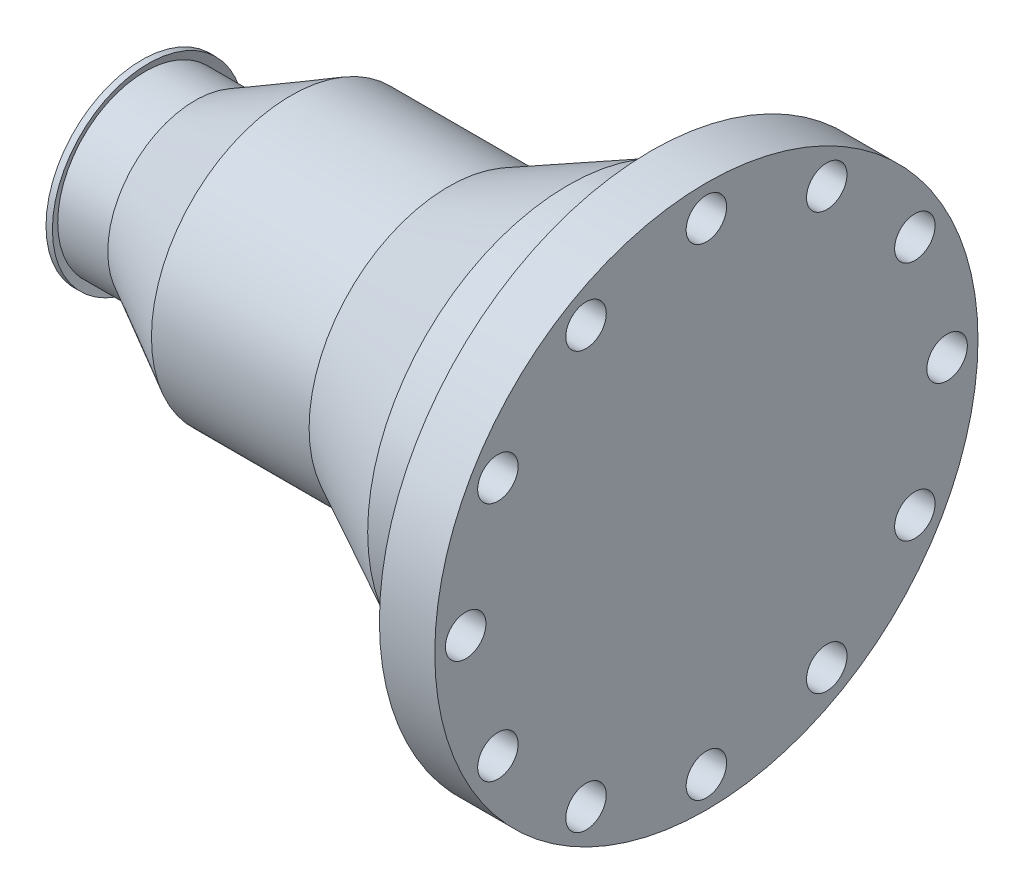
ISO-10303-21;
HEADER;
FILE_DESCRIPTION(('STEP AP214'),'2;1');
FILE_NAME('part.step','',(''),(''),'','','');
FILE_SCHEMA(('AUTOMOTIVE_DESIGN { 1 0 10303 214 1 1 1 1 }'));
ENDSEC;
DATA;
#1=APPLICATION_CONTEXT('core data for automotive mechanical design processes');
#2=APPLICATION_PROTOCOL_DEFINITION('international standard','automotive_design',2000,#1);
#3=PRODUCT_CONTEXT('',#1,'mechanical');
#4=PRODUCT('Part','Part','',(#3));
#5=PRODUCT_RELATED_PRODUCT_CATEGORY('part','',(#4));
#6=PRODUCT_DEFINITION_FORMATION('','',#4);
#7=PRODUCT_DEFINITION_CONTEXT('part definition',#1,'design');
#8=PRODUCT_DEFINITION('design','',#6,#7);
#9=PRODUCT_DEFINITION_SHAPE('','',#8);
#10=(LENGTH_UNIT() NAMED_UNIT(*) SI_UNIT(.MILLI.,.METRE.));
#11=(NAMED_UNIT(*) PLANE_ANGLE_UNIT() SI_UNIT($,.RADIAN.));
#12=(NAMED_UNIT(*) SI_UNIT($,.STERADIAN.) SOLID_ANGLE_UNIT());
#13=UNCERTAINTY_MEASURE_WITH_UNIT(LENGTH_MEASURE(1.E-05),#10,'distance_accuracy_value','');
#14=(GEOMETRIC_REPRESENTATION_CONTEXT(3) GLOBAL_UNCERTAINTY_ASSIGNED_CONTEXT((#13)) GLOBAL_UNIT_ASSIGNED_CONTEXT((#10,
#11,#12)) REPRESENTATION_CONTEXT('',''));
#15=CARTESIAN_POINT('',(0.,0.,0.));
#16=DIRECTION('',(0.,0.,1.));
#17=DIRECTION('',(1.,0.,0.));
#18=AXIS2_PLACEMENT_3D('',#15,#16,#17);
#19=CARTESIAN_POINT('',(0.,0.,0.));
#20=DIRECTION('',(1.,0.,0.));
#21=DIRECTION('',(0.,0.,-1.));
#22=AXIS2_PLACEMENT_3D('',#19,#20,#21);
#23=PLANE('',#22);
#24=CARTESIAN_POINT('',(0.,0.,0.));
#25=DIRECTION('',(-1.,0.,0.));
#26=DIRECTION('',(0.,0.,1.));
#27=AXIS2_PLACEMENT_3D('',#24,#25,#26);
#28=CIRCLE('',#27,31.);
#29=CARTESIAN_POINT('',(0.,0.,31.));
#30=VERTEX_POINT('',#29);
#31=EDGE_CURVE('E80',#30,#30,#28,.T.);
#32=ORIENTED_EDGE('',*,*,#31,.F.);
#33=EDGE_LOOP('',(#32));
#34=FACE_BOUND('',#33,.T.);
#35=CARTESIAN_POINT('',(0.,0.,0.));
#36=DIRECTION('',(-1.,0.,0.));
#37=DIRECTION('',(0.,0.,1.));
#38=AXIS2_PLACEMENT_3D('',#35,#36,#37);
#39=CIRCLE('',#38,45.);
#40=CARTESIAN_POINT('',(0.,0.,45.));
#41=VERTEX_POINT('',#40);
#42=EDGE_CURVE('E10',#41,#41,#39,.T.);
#43=ORIENTED_EDGE('',*,*,#42,.T.);
#44=EDGE_LOOP('',(#43));
#45=FACE_BOUND('',#44,.T.);
#46=ADVANCED_FACE('F37',(#34,#45),#23,.F.);
#47=CARTESIAN_POINT('',(0.,0.,0.));
#48=DIRECTION('',(-1.,0.,0.));
#49=DIRECTION('',(0.,0.,1.));
#50=AXIS2_PLACEMENT_3D('',#47,#48,#49);
#51=CYLINDRICAL_SURFACE('',#50,45.);
#52=ORIENTED_EDGE('',*,*,#42,.F.);
#53=EDGE_LOOP('',(#52));
#54=FACE_BOUND('',#53,.T.);
#55=CARTESIAN_POINT('',(3.,0.,0.));
#56=DIRECTION('',(-1.,0.,0.));
#57=DIRECTION('',(0.,0.,1.));
#58=AXIS2_PLACEMENT_3D('',#55,#56,#57);
#59=CIRCLE('',#58,45.);
#60=CARTESIAN_POINT('',(3.,0.,45.));
#61=VERTEX_POINT('',#60);
#62=EDGE_CURVE('E43',#61,#61,#59,.T.);
#63=ORIENTED_EDGE('',*,*,#62,.T.);
#64=EDGE_LOOP('',(#63));
#65=FACE_BOUND('',#64,.T.);
#66=ADVANCED_FACE('F238',(#54,#65),#51,.T.);
#67=CARTESIAN_POINT('',(1.5,0.,0.));
#68=DIRECTION('',(1.,0.,0.));
#69=DIRECTION('',(0.,0.,-1.));
#70=AXIS2_PLACEMENT_3D('',#67,#68,#69);
#71=CONICAL_SURFACE('',#70,41.,1.21202565652432);
#72=ORIENTED_EDGE('',*,*,#62,.F.);
#73=EDGE_LOOP('',(#72));
#74=FACE_BOUND('',#73,.T.);
#75=CARTESIAN_POINT('',(1.5,0.,0.));
#76=DIRECTION('',(-1.,0.,0.));
#77=DIRECTION('',(0.,0.,1.));
#78=AXIS2_PLACEMENT_3D('',#75,#76,#77);
#79=CIRCLE('',#78,41.);
#80=CARTESIAN_POINT('',(1.5,0.,41.));
#81=VERTEX_POINT('',#80);
#82=EDGE_CURVE('E47',#81,#81,#79,.T.);
#83=ORIENTED_EDGE('',*,*,#82,.T.);
#84=EDGE_LOOP('',(#83));
#85=FACE_BOUND('',#84,.T.);
#86=ADVANCED_FACE('F244',(#74,#85),#71,.F.);
#87=CARTESIAN_POINT('',(0.,0.,0.));
#88=DIRECTION('',(-1.,0.,0.));
#89=DIRECTION('',(0.,0.,1.));
#90=AXIS2_PLACEMENT_3D('',#87,#88,#89);
#91=CYLINDRICAL_SURFACE('',#90,41.);
#92=ORIENTED_EDGE('',*,*,#82,.F.);
#93=EDGE_LOOP('',(#92));
#94=FACE_BOUND('',#93,.T.);
#95=CARTESIAN_POINT('',(25.,0.,0.));
#96=DIRECTION('',(-1.,0.,0.));
#97=DIRECTION('',(0.,0.,1.));
#98=AXIS2_PLACEMENT_3D('',#95,#96,#97);
#99=CIRCLE('',#98,41.);
#100=CARTESIAN_POINT('',(25.,0.,41.));
#101=VERTEX_POINT('',#100);
#102=EDGE_CURVE('E51',#101,#101,#99,.T.);
#103=ORIENTED_EDGE('',*,*,#102,.T.);
#104=EDGE_LOOP('',(#103));
#105=FACE_BOUND('',#104,.T.);
#106=ADVANCED_FACE('F574',(#94,#105),#91,.T.);
#107=CARTESIAN_POINT('',(70.,0.,0.));
#108=DIRECTION('',(1.,0.,0.));
#109=DIRECTION('',(0.,0.,-1.));
#110=AXIS2_PLACEMENT_3D('',#107,#108,#109);
#111=CONICAL_SURFACE('',#110,65.5,0.498567905638218);
#112=ORIENTED_EDGE('',*,*,#102,.F.);
#113=EDGE_LOOP('',(#112));
#114=FACE_BOUND('',#113,.T.);
#115=CARTESIAN_POINT('',(70.,0.,0.));
#116=DIRECTION('',(-1.,0.,0.));
#117=DIRECTION('',(0.,0.,1.));
#118=AXIS2_PLACEMENT_3D('',#115,#116,#117);
#119=CIRCLE('',#118,65.5);
#120=CARTESIAN_POINT('',(70.,0.,65.5));
#121=VERTEX_POINT('',#120);
#122=EDGE_CURVE('E56',#121,#121,#119,.T.);
#123=ORIENTED_EDGE('',*,*,#122,.T.);
#124=EDGE_LOOP('',(#123));
#125=FACE_BOUND('',#124,.T.);
#126=ADVANCED_FACE('F565',(#114,#125),#111,.T.);
#127=CARTESIAN_POINT('',(0.,0.,0.));
#128=DIRECTION('',(-1.,0.,0.));
#129=DIRECTION('',(0.,0.,1.));
#130=AXIS2_PLACEMENT_3D('',#127,#128,#129);
#131=CYLINDRICAL_SURFACE('',#130,65.5);
#132=ORIENTED_EDGE('',*,*,#122,.F.);
#133=EDGE_LOOP('',(#132));
#134=FACE_BOUND('',#133,.T.);
#135=CARTESIAN_POINT('',(144.,0.,0.));
#136=DIRECTION('',(-1.,0.,0.));
#137=DIRECTION('',(0.,0.,1.));
#138=AXIS2_PLACEMENT_3D('',#135,#136,#137);
#139=CIRCLE('',#138,65.5);
#140=CARTESIAN_POINT('',(144.,0.,65.5));
#141=VERTEX_POINT('',#140);
#142=EDGE_CURVE('E59',#141,#141,#139,.T.);
#143=ORIENTED_EDGE('',*,*,#142,.T.);
#144=EDGE_LOOP('',(#143));
#145=FACE_BOUND('',#144,.T.);
#146=ADVANCED_FACE('F556',(#134,#145),#131,.T.);
#147=CARTESIAN_POINT('',(200.,0.,0.));
#148=DIRECTION('',(1.,0.,0.));
#149=DIRECTION('',(0.,0.,-1.));
#150=AXIS2_PLACEMENT_3D('',#147,#148,#149);
#151=CONICAL_SURFACE('',#150,94.,0.470764926542016);
#152=ORIENTED_EDGE('',*,*,#142,.F.);
#153=EDGE_LOOP('',(#152));
#154=FACE_BOUND('',#153,.T.);
#155=CARTESIAN_POINT('',(200.,0.,0.));
#156=DIRECTION('',(-1.,0.,0.));
#157=DIRECTION('',(0.,0.,1.));
#158=AXIS2_PLACEMENT_3D('',#155,#156,#157);
#159=CIRCLE('',#158,94.);
#160=CARTESIAN_POINT('',(200.,0.,94.));
#161=VERTEX_POINT('',#160);
#162=EDGE_CURVE('E62',#161,#161,#159,.T.);
#163=ORIENTED_EDGE('',*,*,#162,.T.);
#164=EDGE_LOOP('',(#163));
#165=FACE_BOUND('',#164,.T.);
#166=ADVANCED_FACE('F547',(#154,#165),#151,.T.);
#167=CARTESIAN_POINT('',(0.,0.,0.));
#168=DIRECTION('',(-1.,0.,0.));
#169=DIRECTION('',(0.,0.,1.));
#170=AXIS2_PLACEMENT_3D('',#167,#168,#169);
#171=CYLINDRICAL_SURFACE('',#170,94.);
#172=ORIENTED_EDGE('',*,*,#162,.F.);
#173=EDGE_LOOP('',(#172));
#174=FACE_BOUND('',#173,.T.);
#175=CARTESIAN_POINT('',(220.,0.,0.));
#176=DIRECTION('',(-1.,0.,0.));
#177=DIRECTION('',(0.,0.,1.));
#178=AXIS2_PLACEMENT_3D('',#175,#176,#177);
#179=CIRCLE('',#178,94.);
#180=CARTESIAN_POINT('',(220.,0.,94.));
#181=VERTEX_POINT('',#180);
#182=EDGE_CURVE('E65',#181,#181,#179,.T.);
#183=ORIENTED_EDGE('',*,*,#182,.T.);
#184=EDGE_LOOP('',(#183));
#185=FACE_BOUND('',#184,.T.);
#186=ADVANCED_FACE('F538',(#174,#185),#171,.T.);
#187=CARTESIAN_POINT('',(220.,94.,0.));
#188=DIRECTION('',(1.,0.,0.));
#189=DIRECTION('',(0.,0.,-1.));
#190=AXIS2_PLACEMENT_3D('',#187,#188,#189);
#191=PLANE('',#190);
#192=ORIENTED_EDGE('',*,*,#182,.F.);
#193=EDGE_LOOP('',(#192));
#194=FACE_BOUND('',#193,.T.);
#195=CARTESIAN_POINT('',(220.,0.,0.));
#196=DIRECTION('',(-1.,0.,0.));
#197=DIRECTION('',(0.,0.,1.));
#198=AXIS2_PLACEMENT_3D('',#195,#196,#197);
#199=CIRCLE('',#198,95.);
#200=CARTESIAN_POINT('',(220.,0.,95.));
#201=VERTEX_POINT('',#200);
#202=EDGE_CURVE('E68',#201,#201,#199,.T.);
#203=ORIENTED_EDGE('',*,*,#202,.T.);
#204=EDGE_LOOP('',(#203));
#205=FACE_BOUND('',#204,.T.);
#206=ADVANCED_FACE('F529',(#194,#205),#191,.F.);
#207=CARTESIAN_POINT('',(0.,0.,0.));
#208=DIRECTION('',(-1.,0.,0.));
#209=DIRECTION('',(0.,0.,1.));
#210=AXIS2_PLACEMENT_3D('',#207,#208,#209);
#211=CYLINDRICAL_SURFACE('',#210,95.);
#212=ORIENTED_EDGE('',*,*,#202,.F.);
#213=EDGE_LOOP('',(#212));
#214=FACE_BOUND('',#213,.T.);
#215=CARTESIAN_POINT('',(239.,0.,0.));
#216=DIRECTION('',(-1.,0.,0.));
#217=DIRECTION('',(0.,0.,1.));
#218=AXIS2_PLACEMENT_3D('',#215,#216,#217);
#219=CIRCLE('',#218,95.);
#220=CARTESIAN_POINT('',(239.,0.,95.));
#221=VERTEX_POINT('',#220);
#222=EDGE_CURVE('E71',#221,#221,#219,.T.);
#223=ORIENTED_EDGE('',*,*,#222,.T.);
#224=EDGE_LOOP('',(#223));
#225=FACE_BOUND('',#224,.T.);
#226=ADVANCED_FACE('F234',(#214,#225),#211,.T.);
#227=CARTESIAN_POINT('',(239.,100.,0.));
#228=DIRECTION('',(1.,0.,0.));
#229=DIRECTION('',(0.,0.,-1.));
#230=AXIS2_PLACEMENT_3D('',#227,#228,#229);
#231=PLANE('',#230);
#232=CARTESIAN_POINT('',(239.,97.8608706276416,-56.5));
#233=DIRECTION('',(1.,0.,0.));
#234=DIRECTION('',(0.,0.,-1.));
#235=AXIS2_PLACEMENT_3D('',#232,#233,#234);
#236=CIRCLE('',#235,9.50000000000001);
#237=CARTESIAN_POINT('',(239.,97.8608706276416,-66.));
#238=VERTEX_POINT('',#237);
#239=EDGE_CURVE('E185',#238,#238,#236,.F.);
#240=ORIENTED_EDGE('',*,*,#239,.F.);
#241=EDGE_LOOP('',(#240));
#242=FACE_BOUND('',#241,.T.);
#243=CARTESIAN_POINT('',(239.,56.4999999999999,-97.8608706276416));
#244=DIRECTION('',(1.,0.,0.));
#245=DIRECTION('',(0.,0.,-1.));
#246=AXIS2_PLACEMENT_3D('',#243,#244,#245);
#247=CIRCLE('',#246,9.5);
#248=CARTESIAN_POINT('',(239.,56.4999999999999,-107.360870627642));
#249=VERTEX_POINT('',#248);
#250=EDGE_CURVE('E179',#249,#249,#247,.F.);
#251=ORIENTED_EDGE('',*,*,#250,.F.);
#252=EDGE_LOOP('',(#251));
#253=FACE_BOUND('',#252,.T.);
#254=CARTESIAN_POINT('',(239.,0.,-113.));
#255=DIRECTION('',(1.,0.,0.));
#256=DIRECTION('',(0.,0.,-1.));
#257=AXIS2_PLACEMENT_3D('',#254,#255,#256);
#258=CIRCLE('',#257,9.49999999999999);
#259=CARTESIAN_POINT('',(239.,0.,-122.5));
#260=VERTEX_POINT('',#259);
#261=EDGE_CURVE('E173',#260,#260,#258,.F.);
#262=ORIENTED_EDGE('',*,*,#261,.F.);
#263=EDGE_LOOP('',(#262));
#264=FACE_BOUND('',#263,.T.);
#265=CARTESIAN_POINT('',(239.,-56.5,-97.8608706276415));
#266=DIRECTION('',(1.,0.,0.));
#267=DIRECTION('',(0.,0.,-1.));
#268=AXIS2_PLACEMENT_3D('',#265,#266,#267);
#269=CIRCLE('',#268,9.5);
#270=CARTESIAN_POINT('',(239.,-56.5,-107.360870627642));
#271=VERTEX_POINT('',#270);
#272=EDGE_CURVE('E167',#271,#271,#269,.F.);
#273=ORIENTED_EDGE('',*,*,#272,.F.);
#274=EDGE_LOOP('',(#273));
#275=FACE_BOUND('',#274,.T.);
#276=CARTESIAN_POINT('',(239.,-97.8608706276416,-56.5));
#277=DIRECTION('',(1.,0.,0.));
#278=DIRECTION('',(0.,0.,-1.));
#279=AXIS2_PLACEMENT_3D('',#276,#277,#278);
#280=CIRCLE('',#279,9.50000000000001);
#281=CARTESIAN_POINT('',(239.,-97.8608706276416,-66.));
#282=VERTEX_POINT('',#281);
#283=EDGE_CURVE('E161',#282,#282,#280,.F.);
#284=ORIENTED_EDGE('',*,*,#283,.F.);
#285=EDGE_LOOP('',(#284));
#286=FACE_BOUND('',#285,.T.);
#287=CARTESIAN_POINT('',(239.,-113.,0.));
#288=DIRECTION('',(1.,0.,0.));
#289=DIRECTION('',(0.,0.,-1.));
#290=AXIS2_PLACEMENT_3D('',#287,#288,#289);
#291=CIRCLE('',#290,9.49999999999998);
#292=CARTESIAN_POINT('',(239.,-113.,-9.49999999999998));
#293=VERTEX_POINT('',#292);
#294=EDGE_CURVE('E155',#293,#293,#291,.F.);
#295=ORIENTED_EDGE('',*,*,#294,.F.);
#296=EDGE_LOOP('',(#295));
#297=FACE_BOUND('',#296,.T.);
#298=CARTESIAN_POINT('',(239.,-97.8608706276415,56.5));
#299=DIRECTION('',(1.,0.,0.));
#300=DIRECTION('',(0.,0.,-1.));
#301=AXIS2_PLACEMENT_3D('',#298,#299,#300);
#302=CIRCLE('',#301,9.5);
#303=CARTESIAN_POINT('',(239.,-97.8608706276415,47.));
#304=VERTEX_POINT('',#303);
#305=EDGE_CURVE('E149',#304,#304,#302,.F.);
#306=ORIENTED_EDGE('',*,*,#305,.F.);
#307=EDGE_LOOP('',(#306));
#308=FACE_BOUND('',#307,.T.);
#309=CARTESIAN_POINT('',(239.,-56.5,97.8608706276416));
#310=DIRECTION('',(1.,0.,0.));
#311=DIRECTION('',(0.,0.,-1.));
#312=AXIS2_PLACEMENT_3D('',#309,#310,#311);
#313=CIRCLE('',#312,9.5);
#314=CARTESIAN_POINT('',(239.,-56.5,88.3608706276416));
#315=VERTEX_POINT('',#314);
#316=EDGE_CURVE('E143',#315,#315,#313,.F.);
#317=ORIENTED_EDGE('',*,*,#316,.F.);
#318=EDGE_LOOP('',(#317));
#319=FACE_BOUND('',#318,.T.);
#320=CARTESIAN_POINT('',(239.,0.,113.));
#321=DIRECTION('',(1.,0.,0.));
#322=DIRECTION('',(0.,0.,-1.));
#323=AXIS2_PLACEMENT_3D('',#320,#321,#322);
#324=CIRCLE('',#323,9.49999999999999);
#325=CARTESIAN_POINT('',(239.,0.,103.5));
#326=VERTEX_POINT('',#325);
#327=EDGE_CURVE('E137',#326,#326,#324,.F.);
#328=ORIENTED_EDGE('',*,*,#327,.F.);
#329=EDGE_LOOP('',(#328));
#330=FACE_BOUND('',#329,.T.);
#331=CARTESIAN_POINT('',(239.,56.5,97.8608706276416));
#332=DIRECTION('',(1.,0.,0.));
#333=DIRECTION('',(0.,0.,-1.));
#334=AXIS2_PLACEMENT_3D('',#331,#332,#333);
#335=CIRCLE('',#334,9.5);
#336=CARTESIAN_POINT('',(239.,56.5,88.3608706276416));
#337=VERTEX_POINT('',#336);
#338=EDGE_CURVE('E131',#337,#337,#335,.F.);
#339=ORIENTED_EDGE('',*,*,#338,.F.);
#340=EDGE_LOOP('',(#339));
#341=FACE_BOUND('',#340,.T.);
#342=CARTESIAN_POINT('',(239.,97.8608706276416,56.5));
#343=DIRECTION('',(1.,0.,0.));
#344=DIRECTION('',(0.,0.,-1.));
#345=AXIS2_PLACEMENT_3D('',#342,#343,#344);
#346=CIRCLE('',#345,9.5);
#347=CARTESIAN_POINT('',(239.,97.8608706276416,47.));
#348=VERTEX_POINT('',#347);
#349=EDGE_CURVE('E125',#348,#348,#346,.F.);
#350=ORIENTED_EDGE('',*,*,#349,.F.);
#351=EDGE_LOOP('',(#350));
#352=FACE_BOUND('',#351,.T.);
#353=CARTESIAN_POINT('',(239.,113.,0.));
#354=DIRECTION('',(1.,0.,0.));
#355=DIRECTION('',(0.,0.,-1.));
#356=AXIS2_PLACEMENT_3D('',#353,#354,#355);
#357=CIRCLE('',#356,9.50000000000001);
#358=CARTESIAN_POINT('',(239.,113.,-9.50000000000001));
#359=VERTEX_POINT('',#358);
#360=EDGE_CURVE('E119',#359,#359,#357,.F.);
#361=ORIENTED_EDGE('',*,*,#360,.F.);
#362=EDGE_LOOP('',(#361));
#363=FACE_BOUND('',#362,.T.);
#364=ORIENTED_EDGE('',*,*,#222,.F.);
#365=EDGE_LOOP('',(#364));
#366=FACE_BOUND('',#365,.T.);
#367=CARTESIAN_POINT('',(239.,0.,0.));
#368=DIRECTION('',(-1.,0.,0.));
#369=DIRECTION('',(0.,0.,1.));
#370=AXIS2_PLACEMENT_3D('',#367,#368,#369);
#371=CIRCLE('',#370,127.5);
#372=CARTESIAN_POINT('',(239.,0.,127.5));
#373=VERTEX_POINT('',#372);
#374=EDGE_CURVE('E74',#373,#373,#371,.T.);
#375=ORIENTED_EDGE('',*,*,#374,.T.);
#376=EDGE_LOOP('',(#375));
#377=FACE_BOUND('',#376,.T.);
#378=ADVANCED_FACE('F226',(#242,#253,#264,#275,#286,#297,#308,#319,#330,#341,#352,#363,#366,
#377),#231,.F.);
#379=CARTESIAN_POINT('',(0.,0.,0.));
#380=DIRECTION('',(-1.,0.,0.));
#381=DIRECTION('',(0.,0.,1.));
#382=AXIS2_PLACEMENT_3D('',#379,#380,#381);
#383=CYLINDRICAL_SURFACE('',#382,127.5);
#384=ORIENTED_EDGE('',*,*,#374,.F.);
#385=EDGE_LOOP('',(#384));
#386=FACE_BOUND('',#385,.T.);
#387=CARTESIAN_POINT('',(265.,0.,0.));
#388=DIRECTION('',(-1.,0.,0.));
#389=DIRECTION('',(0.,0.,1.));
#390=AXIS2_PLACEMENT_3D('',#387,#388,#389);
#391=CIRCLE('',#390,127.5);
#392=CARTESIAN_POINT('',(265.,0.,127.5));
#393=VERTEX_POINT('',#392);
#394=EDGE_CURVE('E77',#393,#393,#391,.T.);
#395=ORIENTED_EDGE('',*,*,#394,.T.);
#396=EDGE_LOOP('',(#395));
#397=FACE_BOUND('',#396,.T.);
#398=ADVANCED_FACE('F199',(#386,#397),#383,.T.);
#399=CARTESIAN_POINT('',(265.,127.5,0.));
#400=DIRECTION('',(-1.,0.,0.));
#401=DIRECTION('',(0.,0.,1.));
#402=AXIS2_PLACEMENT_3D('',#399,#400,#401);
#403=PLANE('',#402);
#404=CARTESIAN_POINT('',(265.,97.8608706276416,-56.5));
#405=DIRECTION('',(1.,0.,0.));
#406=DIRECTION('',(0.,0.,-1.));
#407=AXIS2_PLACEMENT_3D('',#404,#405,#406);
#408=CIRCLE('',#407,9.50000000000001);
#409=CARTESIAN_POINT('',(265.,97.8608706276416,-66.));
#410=VERTEX_POINT('',#409);
#411=EDGE_CURVE('E188',#410,#410,#408,.T.);
#412=ORIENTED_EDGE('',*,*,#411,.F.);
#413=EDGE_LOOP('',(#412));
#414=FACE_BOUND('',#413,.T.);
#415=CARTESIAN_POINT('',(265.,56.4999999999999,-97.8608706276416));
#416=DIRECTION('',(1.,0.,0.));
#417=DIRECTION('',(0.,0.,-1.));
#418=AXIS2_PLACEMENT_3D('',#415,#416,#417);
#419=CIRCLE('',#418,9.5);
#420=CARTESIAN_POINT('',(265.,56.4999999999999,-107.360870627642));
#421=VERTEX_POINT('',#420);
#422=EDGE_CURVE('E182',#421,#421,#419,.T.);
#423=ORIENTED_EDGE('',*,*,#422,.F.);
#424=EDGE_LOOP('',(#423));
#425=FACE_BOUND('',#424,.T.);
#426=CARTESIAN_POINT('',(265.,0.,-113.));
#427=DIRECTION('',(1.,0.,0.));
#428=DIRECTION('',(0.,0.,-1.));
#429=AXIS2_PLACEMENT_3D('',#426,#427,#428);
#430=CIRCLE('',#429,9.49999999999999);
#431=CARTESIAN_POINT('',(265.,0.,-122.5));
#432=VERTEX_POINT('',#431);
#433=EDGE_CURVE('E176',#432,#432,#430,.T.);
#434=ORIENTED_EDGE('',*,*,#433,.F.);
#435=EDGE_LOOP('',(#434));
#436=FACE_BOUND('',#435,.T.);
#437=CARTESIAN_POINT('',(265.,-56.5,-97.8608706276415));
#438=DIRECTION('',(1.,0.,0.));
#439=DIRECTION('',(0.,0.,-1.));
#440=AXIS2_PLACEMENT_3D('',#437,#438,#439);
#441=CIRCLE('',#440,9.5);
#442=CARTESIAN_POINT('',(265.,-56.5,-107.360870627642));
#443=VERTEX_POINT('',#442);
#444=EDGE_CURVE('E170',#443,#443,#441,.T.);
#445=ORIENTED_EDGE('',*,*,#444,.F.);
#446=EDGE_LOOP('',(#445));
#447=FACE_BOUND('',#446,.T.);
#448=CARTESIAN_POINT('',(265.,-97.8608706276416,-56.5));
#449=DIRECTION('',(1.,0.,0.));
#450=DIRECTION('',(0.,0.,-1.));
#451=AXIS2_PLACEMENT_3D('',#448,#449,#450);
#452=CIRCLE('',#451,9.50000000000001);
#453=CARTESIAN_POINT('',(265.,-97.8608706276416,-66.));
#454=VERTEX_POINT('',#453);
#455=EDGE_CURVE('E164',#454,#454,#452,.T.);
#456=ORIENTED_EDGE('',*,*,#455,.F.);
#457=EDGE_LOOP('',(#456));
#458=FACE_BOUND('',#457,.T.);
#459=CARTESIAN_POINT('',(265.,-113.,0.));
#460=DIRECTION('',(1.,0.,0.));
#461=DIRECTION('',(0.,0.,-1.));
#462=AXIS2_PLACEMENT_3D('',#459,#460,#461);
#463=CIRCLE('',#462,9.49999999999998);
#464=CARTESIAN_POINT('',(265.,-113.,-9.49999999999998));
#465=VERTEX_POINT('',#464);
#466=EDGE_CURVE('E158',#465,#465,#463,.T.);
#467=ORIENTED_EDGE('',*,*,#466,.F.);
#468=EDGE_LOOP('',(#467));
#469=FACE_BOUND('',#468,.T.);
#470=CARTESIAN_POINT('',(265.,-97.8608706276415,56.5));
#471=DIRECTION('',(1.,0.,0.));
#472=DIRECTION('',(0.,0.,-1.));
#473=AXIS2_PLACEMENT_3D('',#470,#471,#472);
#474=CIRCLE('',#473,9.5);
#475=CARTESIAN_POINT('',(265.,-97.8608706276415,47.));
#476=VERTEX_POINT('',#475);
#477=EDGE_CURVE('E152',#476,#476,#474,.T.);
#478=ORIENTED_EDGE('',*,*,#477,.F.);
#479=EDGE_LOOP('',(#478));
#480=FACE_BOUND('',#479,.T.);
#481=CARTESIAN_POINT('',(265.,-56.5,97.8608706276416));
#482=DIRECTION('',(1.,0.,0.));
#483=DIRECTION('',(0.,0.,-1.));
#484=AXIS2_PLACEMENT_3D('',#481,#482,#483);
#485=CIRCLE('',#484,9.5);
#486=CARTESIAN_POINT('',(265.,-56.5,88.3608706276416));
#487=VERTEX_POINT('',#486);
#488=EDGE_CURVE('E146',#487,#487,#485,.T.);
#489=ORIENTED_EDGE('',*,*,#488,.F.);
#490=EDGE_LOOP('',(#489));
#491=FACE_BOUND('',#490,.T.);
#492=CARTESIAN_POINT('',(265.,0.,113.));
#493=DIRECTION('',(1.,0.,0.));
#494=DIRECTION('',(0.,0.,-1.));
#495=AXIS2_PLACEMENT_3D('',#492,#493,#494);
#496=CIRCLE('',#495,9.49999999999999);
#497=CARTESIAN_POINT('',(265.,0.,103.5));
#498=VERTEX_POINT('',#497);
#499=EDGE_CURVE('E140',#498,#498,#496,.T.);
#500=ORIENTED_EDGE('',*,*,#499,.F.);
#501=EDGE_LOOP('',(#500));
#502=FACE_BOUND('',#501,.T.);
#503=CARTESIAN_POINT('',(265.,56.5,97.8608706276416));
#504=DIRECTION('',(1.,0.,0.));
#505=DIRECTION('',(0.,0.,-1.));
#506=AXIS2_PLACEMENT_3D('',#503,#504,#505);
#507=CIRCLE('',#506,9.5);
#508=CARTESIAN_POINT('',(265.,56.5,88.3608706276416));
#509=VERTEX_POINT('',#508);
#510=EDGE_CURVE('E134',#509,#509,#507,.T.);
#511=ORIENTED_EDGE('',*,*,#510,.F.);
#512=EDGE_LOOP('',(#511));
#513=FACE_BOUND('',#512,.T.);
#514=CARTESIAN_POINT('',(265.,97.8608706276416,56.5));
#515=DIRECTION('',(1.,0.,0.));
#516=DIRECTION('',(0.,0.,-1.));
#517=AXIS2_PLACEMENT_3D('',#514,#515,#516);
#518=CIRCLE('',#517,9.5);
#519=CARTESIAN_POINT('',(265.,97.8608706276416,47.));
#520=VERTEX_POINT('',#519);
#521=EDGE_CURVE('E128',#520,#520,#518,.T.);
#522=ORIENTED_EDGE('',*,*,#521,.F.);
#523=EDGE_LOOP('',(#522));
#524=FACE_BOUND('',#523,.T.);
#525=CARTESIAN_POINT('',(265.,113.,0.));
#526=DIRECTION('',(1.,0.,0.));
#527=DIRECTION('',(0.,0.,-1.));
#528=AXIS2_PLACEMENT_3D('',#525,#526,#527);
#529=CIRCLE('',#528,9.50000000000001);
#530=CARTESIAN_POINT('',(265.,113.,-9.50000000000001));
#531=VERTEX_POINT('',#530);
#532=EDGE_CURVE('E122',#531,#531,#529,.T.);
#533=ORIENTED_EDGE('',*,*,#532,.F.);
#534=EDGE_LOOP('',(#533));
#535=FACE_BOUND('',#534,.T.);
#536=ORIENTED_EDGE('',*,*,#394,.F.);
#537=EDGE_LOOP('',(#536));
#538=FACE_BOUND('',#537,.T.);
#539=ADVANCED_FACE('F195',(#414,#425,#436,#447,#458,#469,#480,#491,#502,#513,#524,#535,#538),
#403,.F.);
#540=CARTESIAN_POINT('',(0.,0.,0.));
#541=DIRECTION('',(-1.,0.,0.));
#542=DIRECTION('',(0.,0.,1.));
#543=AXIS2_PLACEMENT_3D('',#540,#541,#542);
#544=CYLINDRICAL_SURFACE('',#543,31.);
#545=ORIENTED_EDGE('',*,*,#31,.T.);
#546=EDGE_LOOP('',(#545));
#547=FACE_BOUND('',#546,.T.);
#548=CARTESIAN_POINT('',(42.,0.,0.));
#549=DIRECTION('',(-1.,0.,0.));
#550=DIRECTION('',(0.,0.,1.));
#551=AXIS2_PLACEMENT_3D('',#548,#549,#550);
#552=CIRCLE('',#551,31.);
#553=CARTESIAN_POINT('',(42.,0.,31.));
#554=VERTEX_POINT('',#553);
#555=EDGE_CURVE('E83',#554,#554,#552,.T.);
#556=ORIENTED_EDGE('',*,*,#555,.F.);
#557=EDGE_LOOP('',(#556));
#558=FACE_BOUND('',#557,.T.);
#559=ADVANCED_FACE('F198',(#547,#558),#544,.F.);
#560=CARTESIAN_POINT('',(70.,0.,0.));
#561=DIRECTION('',(1.,0.,0.));
#562=DIRECTION('',(0.,0.,-1.));
#563=AXIS2_PLACEMENT_3D('',#560,#561,#562);
#564=CONICAL_SURFACE('',#563,38.502577,0.261799374867879);
#565=ORIENTED_EDGE('',*,*,#555,.T.);
#566=EDGE_LOOP('',(#565));
#567=FACE_BOUND('',#566,.T.);
#568=CARTESIAN_POINT('',(70.,0.,0.));
#569=DIRECTION('',(-1.,0.,0.));
#570=DIRECTION('',(0.,0.,1.));
#571=AXIS2_PLACEMENT_3D('',#568,#569,#570);
#572=CIRCLE('',#571,38.502577);
#573=CARTESIAN_POINT('',(70.,0.,38.502577));
#574=VERTEX_POINT('',#573);
#575=EDGE_CURVE('E86',#574,#574,#572,.T.);
#576=ORIENTED_EDGE('',*,*,#575,.F.);
#577=EDGE_LOOP('',(#576));
#578=FACE_BOUND('',#577,.T.);
#579=ADVANCED_FACE('F249',(#567,#578),#564,.F.);
#580=CARTESIAN_POINT('',(107.802202951022,0.,0.));
#581=DIRECTION('',(-1.,0.,0.));
#582=DIRECTION('',(0.,0.,1.));
#583=AXIS2_PLACEMENT_3D('',#580,#581,#582);
#584=DEGENERATE_TOROIDAL_SURFACE('',#583,5.77654352226822,49.9999981513586,.T.);
#585=ORIENTED_EDGE('',*,*,#575,.T.);
#586=EDGE_LOOP('',(#585));
#587=FACE_BOUND('',#586,.T.);
#588=CARTESIAN_POINT('',(90.,0.,0.));
#589=DIRECTION('',(-1.,0.,0.));
#590=DIRECTION('',(0.,0.,1.));
#591=AXIS2_PLACEMENT_3D('',#588,#589,#590);
#592=CIRCLE('',#591,52.5);
#593=CARTESIAN_POINT('',(90.,0.,52.5));
#594=VERTEX_POINT('',#593);
#595=EDGE_CURVE('E89',#594,#594,#592,.T.);
#596=ORIENTED_EDGE('',*,*,#595,.F.);
#597=EDGE_LOOP('',(#596));
#598=FACE_BOUND('',#597,.T.);
#599=ADVANCED_FACE('F255',(#587,#598),#584,.F.);
#600=CARTESIAN_POINT('',(0.,0.,0.));
#601=DIRECTION('',(-1.,0.,0.));
#602=DIRECTION('',(0.,0.,1.));
#603=AXIS2_PLACEMENT_3D('',#600,#601,#602);
#604=CYLINDRICAL_SURFACE('',#603,52.5);
#605=ORIENTED_EDGE('',*,*,#595,.T.);
#606=EDGE_LOOP('',(#605));
#607=FACE_BOUND('',#606,.T.);
#608=CARTESIAN_POINT('',(142.,0.,0.));
#609=DIRECTION('',(-1.,0.,0.));
#610=DIRECTION('',(0.,0.,1.));
#611=AXIS2_PLACEMENT_3D('',#608,#609,#610);
#612=CIRCLE('',#611,52.5);
#613=CARTESIAN_POINT('',(142.,0.,52.5));
#614=VERTEX_POINT('',#613);
#615=EDGE_CURVE('E92',#614,#614,#612,.T.);
#616=ORIENTED_EDGE('',*,*,#615,.F.);
#617=EDGE_LOOP('',(#616));
#618=FACE_BOUND('',#617,.T.);
#619=ADVANCED_FACE('F261',(#607,#618),#604,.F.);
#620=CARTESIAN_POINT('',(142.75,0.,0.));
#621=DIRECTION('',(-1.,0.,0.));
#622=DIRECTION('',(0.,0.,1.));
#623=AXIS2_PLACEMENT_3D('',#620,#621,#622);
#624=TOROIDAL_SURFACE('',#623,49.8031848031275,2.79916276877255);
#625=ORIENTED_EDGE('',*,*,#615,.T.);
#626=EDGE_LOOP('',(#625));
#627=FACE_BOUND('',#626,.T.);
#628=CARTESIAN_POINT('',(143.5,0.,0.));
#629=DIRECTION('',(-1.,0.,0.));
#630=DIRECTION('',(0.,0.,1.));
#631=AXIS2_PLACEMENT_3D('',#628,#629,#630);
#632=CIRCLE('',#631,52.5);
#633=CARTESIAN_POINT('',(143.5,0.,52.5));
#634=VERTEX_POINT('',#633);
#635=EDGE_CURVE('E95',#634,#634,#632,.T.);
#636=ORIENTED_EDGE('',*,*,#635,.F.);
#637=EDGE_LOOP('',(#636));
#638=FACE_BOUND('',#637,.T.);
#639=ADVANCED_FACE('F267',(#627,#638),#624,.F.);
#640=CARTESIAN_POINT('',(0.,0.,0.));
#641=DIRECTION('',(-1.,0.,0.));
#642=DIRECTION('',(0.,0.,1.));
#643=AXIS2_PLACEMENT_3D('',#640,#641,#642);
#644=CYLINDRICAL_SURFACE('',#643,52.5);
#645=ORIENTED_EDGE('',*,*,#635,.T.);
#646=EDGE_LOOP('',(#645));
#647=FACE_BOUND('',#646,.T.);
#648=CARTESIAN_POINT('',(146.669872,0.,0.));
#649=DIRECTION('',(-1.,0.,0.));
#650=DIRECTION('',(0.,0.,1.));
#651=AXIS2_PLACEMENT_3D('',#648,#649,#650);
#652=CIRCLE('',#651,52.5);
#653=CARTESIAN_POINT('',(146.669872,0.,52.5));
#654=VERTEX_POINT('',#653);
#655=EDGE_CURVE('E98',#654,#654,#652,.T.);
#656=ORIENTED_EDGE('',*,*,#655,.F.);
#657=EDGE_LOOP('',(#656));
#658=FACE_BOUND('',#657,.T.);
#659=ADVANCED_FACE('F273',(#647,#658),#644,.F.);
#660=CARTESIAN_POINT('',(147.593438045,0.,0.));
#661=DIRECTION('',(-1.,0.,0.));
#662=DIRECTION('',(0.,0.,1.));
#663=AXIS2_PLACEMENT_3D('',#660,#661,#662);
#664=TOROIDAL_SURFACE('',#663,53.580573582,1.42148285448445);
#665=ORIENTED_EDGE('',*,*,#655,.T.);
#666=EDGE_LOOP('',(#665));
#667=FACE_BOUND('',#666,.T.);
#668=CARTESIAN_POINT('',(147.669872,0.,0.));
#669=DIRECTION('',(-1.,0.,0.));
#670=DIRECTION('',(0.,0.,1.));
#671=AXIS2_PLACEMENT_3D('',#668,#669,#670);
#672=CIRCLE('',#671,55.);
#673=CARTESIAN_POINT('',(147.669872,0.,55.));
#674=VERTEX_POINT('',#673);
#675=EDGE_CURVE('E101',#674,#674,#672,.T.);
#676=ORIENTED_EDGE('',*,*,#675,.F.);
#677=EDGE_LOOP('',(#676));
#678=FACE_BOUND('',#677,.T.);
#679=ADVANCED_FACE('F279',(#667,#678),#664,.F.);
#680=CARTESIAN_POINT('',(0.,0.,0.));
#681=DIRECTION('',(-1.,0.,0.));
#682=DIRECTION('',(0.,0.,1.));
#683=AXIS2_PLACEMENT_3D('',#680,#681,#682);
#684=CYLINDRICAL_SURFACE('',#683,55.);
#685=ORIENTED_EDGE('',*,*,#675,.T.);
#686=EDGE_LOOP('',(#685));
#687=FACE_BOUND('',#686,.T.);
#688=CARTESIAN_POINT('',(203.5,0.,0.));
#689=DIRECTION('',(-1.,0.,0.));
#690=DIRECTION('',(0.,0.,1.));
#691=AXIS2_PLACEMENT_3D('',#688,#689,#690);
#692=CIRCLE('',#691,55.);
#693=CARTESIAN_POINT('',(203.5,0.,55.));
#694=VERTEX_POINT('',#693);
#695=EDGE_CURVE('E104',#694,#694,#692,.T.);
#696=ORIENTED_EDGE('',*,*,#695,.F.);
#697=EDGE_LOOP('',(#696));
#698=FACE_BOUND('',#697,.T.);
#699=ADVANCED_FACE('F285',(#687,#698),#684,.F.);
#700=CARTESIAN_POINT('',(203.5,55.,0.));
#701=DIRECTION('',(-1.,0.,0.));
#702=DIRECTION('',(0.,0.,1.));
#703=AXIS2_PLACEMENT_3D('',#700,#701,#702);
#704=PLANE('',#703);
#705=ORIENTED_EDGE('',*,*,#695,.T.);
#706=EDGE_LOOP('',(#705));
#707=FACE_BOUND('',#706,.T.);
#708=CARTESIAN_POINT('',(203.5,0.,0.));
#709=DIRECTION('',(-1.,0.,0.));
#710=DIRECTION('',(0.,0.,1.));
#711=AXIS2_PLACEMENT_3D('',#708,#709,#710);
#712=CIRCLE('',#711,47.);
#713=CARTESIAN_POINT('',(203.5,0.,47.));
#714=VERTEX_POINT('',#713);
#715=EDGE_CURVE('E107',#714,#714,#712,.T.);
#716=ORIENTED_EDGE('',*,*,#715,.F.);
#717=EDGE_LOOP('',(#716));
#718=FACE_BOUND('',#717,.T.);
#719=ADVANCED_FACE('F291',(#707,#718),#704,.T.);
#720=CARTESIAN_POINT('',(0.,0.,0.));
#721=DIRECTION('',(-1.,0.,0.));
#722=DIRECTION('',(0.,0.,1.));
#723=AXIS2_PLACEMENT_3D('',#720,#721,#722);
#724=CYLINDRICAL_SURFACE('',#723,47.);
#725=ORIENTED_EDGE('',*,*,#715,.T.);
#726=EDGE_LOOP('',(#725));
#727=FACE_BOUND('',#726,.T.);
#728=CARTESIAN_POINT('',(226.,0.,0.));
#729=DIRECTION('',(-1.,0.,0.));
#730=DIRECTION('',(0.,0.,1.));
#731=AXIS2_PLACEMENT_3D('',#728,#729,#730);
#732=CIRCLE('',#731,47.);
#733=CARTESIAN_POINT('',(226.,0.,47.));
#734=VERTEX_POINT('',#733);
#735=EDGE_CURVE('E110',#734,#734,#732,.T.);
#736=ORIENTED_EDGE('',*,*,#735,.F.);
#737=EDGE_LOOP('',(#736));
#738=FACE_BOUND('',#737,.T.);
#739=ADVANCED_FACE('F297',(#727,#738),#724,.F.);
#740=CARTESIAN_POINT('',(239.,0.,0.));
#741=DIRECTION('',(-1.,0.,0.));
#742=DIRECTION('',(0.,0.,1.));
#743=AXIS2_PLACEMENT_3D('',#740,#741,#742);
#744=CONICAL_SURFACE('',#743,34.,0.785398163397449);
#745=ORIENTED_EDGE('',*,*,#735,.T.);
#746=EDGE_LOOP('',(#745));
#747=FACE_BOUND('',#746,.T.);
#748=CARTESIAN_POINT('',(239.,0.,0.));
#749=DIRECTION('',(-1.,0.,0.));
#750=DIRECTION('',(0.,0.,1.));
#751=AXIS2_PLACEMENT_3D('',#748,#749,#750);
#752=CIRCLE('',#751,34.);
#753=CARTESIAN_POINT('',(239.,0.,34.));
#754=VERTEX_POINT('',#753);
#755=EDGE_CURVE('E113',#754,#754,#752,.T.);
#756=ORIENTED_EDGE('',*,*,#755,.F.);
#757=EDGE_LOOP('',(#756));
#758=FACE_BOUND('',#757,.T.);
#759=ADVANCED_FACE('F303',(#747,#758),#744,.F.);
#760=CARTESIAN_POINT('',(0.,0.,0.));
#761=DIRECTION('',(-1.,0.,0.));
#762=DIRECTION('',(0.,0.,1.));
#763=AXIS2_PLACEMENT_3D('',#760,#761,#762);
#764=CYLINDRICAL_SURFACE('',#763,34.);
#765=ORIENTED_EDGE('',*,*,#755,.T.);
#766=EDGE_LOOP('',(#765));
#767=FACE_BOUND('',#766,.T.);
#768=CARTESIAN_POINT('',(257.,0.,0.));
#769=DIRECTION('',(-1.,0.,0.));
#770=DIRECTION('',(0.,0.,1.));
#771=AXIS2_PLACEMENT_3D('',#768,#769,#770);
#772=CIRCLE('',#771,34.);
#773=CARTESIAN_POINT('',(257.,0.,34.));
#774=VERTEX_POINT('',#773);
#775=EDGE_CURVE('E116',#774,#774,#772,.T.);
#776=ORIENTED_EDGE('',*,*,#775,.F.);
#777=EDGE_LOOP('',(#776));
#778=FACE_BOUND('',#777,.T.);
#779=ADVANCED_FACE('F309',(#767,#778),#764,.F.);
#780=CARTESIAN_POINT('',(257.,34.,0.));
#781=DIRECTION('',(-1.,0.,0.));
#782=DIRECTION('',(0.,0.,1.));
#783=AXIS2_PLACEMENT_3D('',#780,#781,#782);
#784=PLANE('',#783);
#785=ORIENTED_EDGE('',*,*,#775,.T.);
#786=EDGE_LOOP('',(#785));
#787=FACE_BOUND('',#786,.T.);
#788=ADVANCED_FACE('F315',(#787),#784,.T.);
#789=CARTESIAN_POINT('',(265.,113.,0.));
#790=DIRECTION('',(-1.,0.,0.));
#791=DIRECTION('',(0.,0.,1.));
#792=AXIS2_PLACEMENT_3D('',#789,#790,#791);
#793=CYLINDRICAL_SURFACE('',#792,9.50000000000001);
#794=ORIENTED_EDGE('',*,*,#532,.T.);
#795=EDGE_LOOP('',(#794));
#796=FACE_BOUND('',#795,.T.);
#797=ORIENTED_EDGE('',*,*,#360,.T.);
#798=EDGE_LOOP('',(#797));
#799=FACE_BOUND('',#798,.T.);
#800=ADVANCED_FACE('F320',(#796,#799),#793,.F.);
#801=CARTESIAN_POINT('',(265.,97.8608706276416,56.5));
#802=DIRECTION('',(-1.,0.,0.));
#803=DIRECTION('',(0.,0.,1.));
#804=AXIS2_PLACEMENT_3D('',#801,#802,#803);
#805=CYLINDRICAL_SURFACE('',#804,9.5);
#806=ORIENTED_EDGE('',*,*,#521,.T.);
#807=EDGE_LOOP('',(#806));
#808=FACE_BOUND('',#807,.T.);
#809=ORIENTED_EDGE('',*,*,#349,.T.);
#810=EDGE_LOOP('',(#809));
#811=FACE_BOUND('',#810,.T.);
#812=ADVANCED_FACE('F325',(#808,#811),#805,.F.);
#813=CARTESIAN_POINT('',(265.,56.5,97.8608706276416));
#814=DIRECTION('',(-1.,0.,0.));
#815=DIRECTION('',(0.,0.,1.));
#816=AXIS2_PLACEMENT_3D('',#813,#814,#815);
#817=CYLINDRICAL_SURFACE('',#816,9.5);
#818=ORIENTED_EDGE('',*,*,#510,.T.);
#819=EDGE_LOOP('',(#818));
#820=FACE_BOUND('',#819,.T.);
#821=ORIENTED_EDGE('',*,*,#338,.T.);
#822=EDGE_LOOP('',(#821));
#823=FACE_BOUND('',#822,.T.);
#824=ADVANCED_FACE('F331',(#820,#823),#817,.F.);
#825=CARTESIAN_POINT('',(265.,0.,113.));
#826=DIRECTION('',(-1.,0.,0.));
#827=DIRECTION('',(0.,0.,1.));
#828=AXIS2_PLACEMENT_3D('',#825,#826,#827);
#829=CYLINDRICAL_SURFACE('',#828,9.49999999999999);
#830=ORIENTED_EDGE('',*,*,#499,.T.);
#831=EDGE_LOOP('',(#830));
#832=FACE_BOUND('',#831,.T.);
#833=ORIENTED_EDGE('',*,*,#327,.T.);
#834=EDGE_LOOP('',(#833));
#835=FACE_BOUND('',#834,.T.);
#836=ADVANCED_FACE('F335',(#832,#835),#829,.F.);
#837=CARTESIAN_POINT('',(265.,-56.5,97.8608706276416));
#838=DIRECTION('',(-1.,0.,0.));
#839=DIRECTION('',(0.,0.,1.));
#840=AXIS2_PLACEMENT_3D('',#837,#838,#839);
#841=CYLINDRICAL_SURFACE('',#840,9.5);
#842=ORIENTED_EDGE('',*,*,#488,.T.);
#843=EDGE_LOOP('',(#842));
#844=FACE_BOUND('',#843,.T.);
#845=ORIENTED_EDGE('',*,*,#316,.T.);
#846=EDGE_LOOP('',(#845));
#847=FACE_BOUND('',#846,.T.);
#848=ADVANCED_FACE('F339',(#844,#847),#841,.F.);
#849=CARTESIAN_POINT('',(265.,-97.8608706276415,56.5));
#850=DIRECTION('',(-1.,0.,0.));
#851=DIRECTION('',(0.,0.,1.));
#852=AXIS2_PLACEMENT_3D('',#849,#850,#851);
#853=CYLINDRICAL_SURFACE('',#852,9.5);
#854=ORIENTED_EDGE('',*,*,#477,.T.);
#855=EDGE_LOOP('',(#854));
#856=FACE_BOUND('',#855,.T.);
#857=ORIENTED_EDGE('',*,*,#305,.T.);
#858=EDGE_LOOP('',(#857));
#859=FACE_BOUND('',#858,.T.);
#860=ADVANCED_FACE('F343',(#856,#859),#853,.F.);
#861=CARTESIAN_POINT('',(265.,-113.,0.));
#862=DIRECTION('',(-1.,0.,0.));
#863=DIRECTION('',(0.,0.,1.));
#864=AXIS2_PLACEMENT_3D('',#861,#862,#863);
#865=CYLINDRICAL_SURFACE('',#864,9.49999999999998);
#866=ORIENTED_EDGE('',*,*,#466,.T.);
#867=EDGE_LOOP('',(#866));
#868=FACE_BOUND('',#867,.T.);
#869=ORIENTED_EDGE('',*,*,#294,.T.);
#870=EDGE_LOOP('',(#869));
#871=FACE_BOUND('',#870,.T.);
#872=ADVANCED_FACE('F347',(#868,#871),#865,.F.);
#873=CARTESIAN_POINT('',(265.,-97.8608706276416,-56.5));
#874=DIRECTION('',(-1.,0.,0.));
#875=DIRECTION('',(0.,0.,1.));
#876=AXIS2_PLACEMENT_3D('',#873,#874,#875);
#877=CYLINDRICAL_SURFACE('',#876,9.50000000000001);
#878=ORIENTED_EDGE('',*,*,#455,.T.);
#879=EDGE_LOOP('',(#878));
#880=FACE_BOUND('',#879,.T.);
#881=ORIENTED_EDGE('',*,*,#283,.T.);
#882=EDGE_LOOP('',(#881));
#883=FACE_BOUND('',#882,.T.);
#884=ADVANCED_FACE('F351',(#880,#883),#877,.F.);
#885=CARTESIAN_POINT('',(265.,-56.5,-97.8608706276415));
#886=DIRECTION('',(-1.,0.,0.));
#887=DIRECTION('',(0.,0.,1.));
#888=AXIS2_PLACEMENT_3D('',#885,#886,#887);
#889=CYLINDRICAL_SURFACE('',#888,9.5);
#890=ORIENTED_EDGE('',*,*,#444,.T.);
#891=EDGE_LOOP('',(#890));
#892=FACE_BOUND('',#891,.T.);
#893=ORIENTED_EDGE('',*,*,#272,.T.);
#894=EDGE_LOOP('',(#893));
#895=FACE_BOUND('',#894,.T.);
#896=ADVANCED_FACE('F355',(#892,#895),#889,.F.);
#897=CARTESIAN_POINT('',(265.,0.,-113.));
#898=DIRECTION('',(-1.,0.,0.));
#899=DIRECTION('',(0.,0.,1.));
#900=AXIS2_PLACEMENT_3D('',#897,#898,#899);
#901=CYLINDRICAL_SURFACE('',#900,9.49999999999999);
#902=ORIENTED_EDGE('',*,*,#433,.T.);
#903=EDGE_LOOP('',(#902));
#904=FACE_BOUND('',#903,.T.);
#905=ORIENTED_EDGE('',*,*,#261,.T.);
#906=EDGE_LOOP('',(#905));
#907=FACE_BOUND('',#906,.T.);
#908=ADVANCED_FACE('F359',(#904,#907),#901,.F.);
#909=CARTESIAN_POINT('',(265.,56.4999999999999,-97.8608706276416));
#910=DIRECTION('',(-1.,0.,0.));
#911=DIRECTION('',(0.,0.,1.));
#912=AXIS2_PLACEMENT_3D('',#909,#910,#911);
#913=CYLINDRICAL_SURFACE('',#912,9.5);
#914=ORIENTED_EDGE('',*,*,#422,.T.);
#915=EDGE_LOOP('',(#914));
#916=FACE_BOUND('',#915,.T.);
#917=ORIENTED_EDGE('',*,*,#250,.T.);
#918=EDGE_LOOP('',(#917));
#919=FACE_BOUND('',#918,.T.);
#920=ADVANCED_FACE('F363',(#916,#919),#913,.F.);
#921=CARTESIAN_POINT('',(265.,97.8608706276416,-56.5));
#922=DIRECTION('',(-1.,0.,0.));
#923=DIRECTION('',(0.,0.,1.));
#924=AXIS2_PLACEMENT_3D('',#921,#922,#923);
#925=CYLINDRICAL_SURFACE('',#924,9.50000000000001);
#926=ORIENTED_EDGE('',*,*,#411,.T.);
#927=EDGE_LOOP('',(#926));
#928=FACE_BOUND('',#927,.T.);
#929=ORIENTED_EDGE('',*,*,#239,.T.);
#930=EDGE_LOOP('',(#929));
#931=FACE_BOUND('',#930,.T.);
#932=ADVANCED_FACE('F192',(#928,#931),#925,.F.);
#933=CLOSED_SHELL('',(#46,#66,#86,#106,#126,#146,#166,#186,#206,#226,#378,#398,#539,#559,#579,
#599,#619,#639,#659,#679,#699,#719,#739,#759,#779,#788,#800,#812,#824,#836,#848,#860,#872,#884,
#896,#908,#920,#932));
#934=MANIFOLD_SOLID_BREP('B2',#933);
#935=ADVANCED_BREP_SHAPE_REPRESENTATION('',(#18,#934),#14);
#936=SHAPE_DEFINITION_REPRESENTATION(#9,#935);
ENDSEC;
END-ISO-10303-21;
